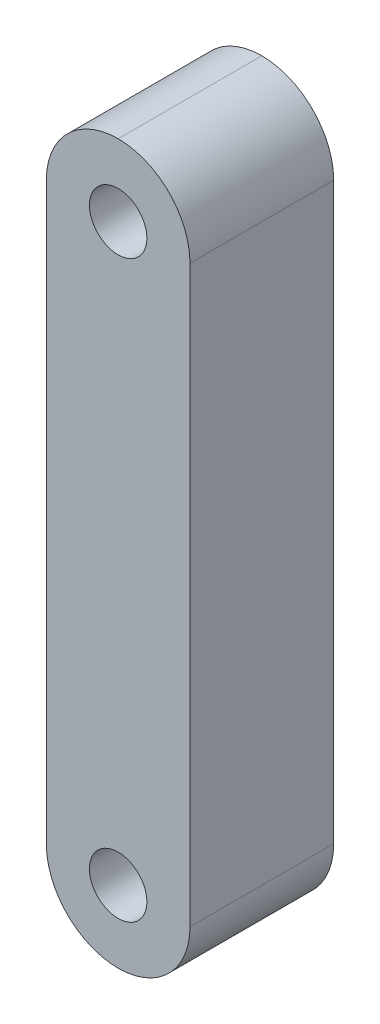
ISO-10303-21;
HEADER;
FILE_DESCRIPTION(('STEP AP214'),'2;1');
FILE_NAME('part.step','',(''),(''),'','','');
FILE_SCHEMA(('AUTOMOTIVE_DESIGN { 1 0 10303 214 1 1 1 1 }'));
ENDSEC;
DATA;
#1=APPLICATION_CONTEXT('core data for automotive mechanical design processes');
#2=APPLICATION_PROTOCOL_DEFINITION('international standard','automotive_design',2000,#1);
#3=PRODUCT_CONTEXT('',#1,'mechanical');
#4=PRODUCT('Part','Part','',(#3));
#5=PRODUCT_RELATED_PRODUCT_CATEGORY('part','',(#4));
#6=PRODUCT_DEFINITION_FORMATION('','',#4);
#7=PRODUCT_DEFINITION_CONTEXT('part definition',#1,'design');
#8=PRODUCT_DEFINITION('design','',#6,#7);
#9=PRODUCT_DEFINITION_SHAPE('','',#8);
#10=(LENGTH_UNIT() NAMED_UNIT(*) SI_UNIT(.MILLI.,.METRE.));
#11=(NAMED_UNIT(*) PLANE_ANGLE_UNIT() SI_UNIT($,.RADIAN.));
#12=(NAMED_UNIT(*) SI_UNIT($,.STERADIAN.) SOLID_ANGLE_UNIT());
#13=UNCERTAINTY_MEASURE_WITH_UNIT(LENGTH_MEASURE(1.E-05),#10,'distance_accuracy_value','');
#14=(GEOMETRIC_REPRESENTATION_CONTEXT(3) GLOBAL_UNCERTAINTY_ASSIGNED_CONTEXT((#13)) GLOBAL_UNIT_ASSIGNED_CONTEXT((#10,
#11,#12)) REPRESENTATION_CONTEXT('',''));
#15=CARTESIAN_POINT('',(0.,0.,0.));
#16=DIRECTION('',(0.,0.,1.));
#17=DIRECTION('',(1.,0.,0.));
#18=AXIS2_PLACEMENT_3D('',#15,#16,#17);
#19=CARTESIAN_POINT('',(0.,0.,10.));
#20=DIRECTION('',(1.,0.,0.));
#21=DIRECTION('',(0.,0.,-1.));
#22=AXIS2_PLACEMENT_3D('',#19,#20,#21);
#23=PLANE('',#22);
#24=DIRECTION('',(0.,-1.,0.));
#25=VECTOR('',#24,1.);
#26=CARTESIAN_POINT('',(0.,0.,0.));
#27=LINE('',#26,#25);
#28=CARTESIAN_POINT('',(0.,45.,0.));
#29=VERTEX_POINT('',#28);
#30=CARTESIAN_POINT('',(0.,5.,0.));
#31=VERTEX_POINT('',#30);
#32=EDGE_CURVE('E114',#29,#31,#27,.T.);
#33=ORIENTED_EDGE('',*,*,#32,.T.);
#34=DIRECTION('',(0.,0.,-1.));
#35=VECTOR('',#34,1.);
#36=CARTESIAN_POINT('',(0.,5.,10.));
#37=LINE('',#36,#35);
#38=CARTESIAN_POINT('',(0.,5.,10.));
#39=VERTEX_POINT('',#38);
#40=EDGE_CURVE('E11',#31,#39,#37,.F.);
#41=ORIENTED_EDGE('',*,*,#40,.T.);
#42=DIRECTION('',(0.,-1.,0.));
#43=VECTOR('',#42,1.);
#44=CARTESIAN_POINT('',(0.,0.,10.));
#45=LINE('',#44,#43);
#46=CARTESIAN_POINT('',(0.,45.,10.));
#47=VERTEX_POINT('',#46);
#48=EDGE_CURVE('E113',#47,#39,#45,.T.);
#49=ORIENTED_EDGE('',*,*,#48,.F.);
#50=DIRECTION('',(0.,0.,-1.));
#51=VECTOR('',#50,1.);
#52=CARTESIAN_POINT('',(0.,45.,10.));
#53=LINE('',#52,#51);
#54=EDGE_CURVE('E42',#47,#29,#53,.T.);
#55=ORIENTED_EDGE('',*,*,#54,.T.);
#56=EDGE_LOOP('',(#33,#41,#49,#55));
#57=FACE_BOUND('',#56,.T.);
#58=ADVANCED_FACE('F33',(#57),#23,.F.);
#59=CARTESIAN_POINT('',(10.,0.,10.));
#60=DIRECTION('',(-1.,0.,0.));
#61=DIRECTION('',(0.,0.,1.));
#62=AXIS2_PLACEMENT_3D('',#59,#60,#61);
#63=PLANE('',#62);
#64=DIRECTION('',(0.,1.,0.));
#65=VECTOR('',#64,1.);
#66=CARTESIAN_POINT('',(10.,0.,10.));
#67=LINE('',#66,#65);
#68=CARTESIAN_POINT('',(10.,5.,10.));
#69=VERTEX_POINT('',#68);
#70=CARTESIAN_POINT('',(10.,45.,10.));
#71=VERTEX_POINT('',#70);
#72=EDGE_CURVE('E106',#69,#71,#67,.T.);
#73=ORIENTED_EDGE('',*,*,#72,.F.);
#74=DIRECTION('',(0.,0.,-1.));
#75=VECTOR('',#74,1.);
#76=CARTESIAN_POINT('',(10.,5.,10.));
#77=LINE('',#76,#75);
#78=CARTESIAN_POINT('',(10.,5.,0.));
#79=VERTEX_POINT('',#78);
#80=EDGE_CURVE('E91',#69,#79,#77,.T.);
#81=ORIENTED_EDGE('',*,*,#80,.T.);
#82=DIRECTION('',(0.,1.,0.));
#83=VECTOR('',#82,1.);
#84=CARTESIAN_POINT('',(10.,0.,0.));
#85=LINE('',#84,#83);
#86=CARTESIAN_POINT('',(10.,45.,0.));
#87=VERTEX_POINT('',#86);
#88=EDGE_CURVE('E104',#79,#87,#85,.T.);
#89=ORIENTED_EDGE('',*,*,#88,.T.);
#90=DIRECTION('',(0.,0.,-1.));
#91=VECTOR('',#90,1.);
#92=CARTESIAN_POINT('',(10.,45.,10.));
#93=LINE('',#92,#91);
#94=EDGE_CURVE('E108',#87,#71,#93,.F.);
#95=ORIENTED_EDGE('',*,*,#94,.T.);
#96=EDGE_LOOP('',(#73,#81,#89,#95));
#97=FACE_BOUND('',#96,.T.);
#98=ADVANCED_FACE('F102',(#97),#63,.F.);
#99=CARTESIAN_POINT('',(0.,0.,10.));
#100=DIRECTION('',(0.,0.,-1.));
#101=DIRECTION('',(-1.,0.,0.));
#102=AXIS2_PLACEMENT_3D('',#99,#100,#101);
#103=PLANE('',#102);
#104=CARTESIAN_POINT('',(5.,5.,10.));
#105=DIRECTION('',(0.,0.,1.));
#106=DIRECTION('',(1.,0.,0.));
#107=AXIS2_PLACEMENT_3D('',#104,#105,#106);
#108=CIRCLE('',#107,2.);
#109=CARTESIAN_POINT('',(7.,5.,10.));
#110=VERTEX_POINT('',#109);
#111=EDGE_CURVE('E131',#110,#110,#108,.T.);
#112=ORIENTED_EDGE('',*,*,#111,.F.);
#113=EDGE_LOOP('',(#112));
#114=FACE_BOUND('',#113,.T.);
#115=CARTESIAN_POINT('',(5.,45.,10.));
#116=DIRECTION('',(0.,0.,1.));
#117=DIRECTION('',(1.,0.,0.));
#118=AXIS2_PLACEMENT_3D('',#115,#116,#117);
#119=CIRCLE('',#118,2.);
#120=CARTESIAN_POINT('',(7.,45.,10.));
#121=VERTEX_POINT('',#120);
#122=EDGE_CURVE('E150',#121,#121,#119,.T.);
#123=ORIENTED_EDGE('',*,*,#122,.F.);
#124=EDGE_LOOP('',(#123));
#125=FACE_BOUND('',#124,.T.);
#126=CARTESIAN_POINT('',(5.,5.,10.));
#127=DIRECTION('',(0.,0.,-1.));
#128=DIRECTION('',(-1.,0.,0.));
#129=AXIS2_PLACEMENT_3D('',#126,#127,#128);
#130=CIRCLE('',#129,5.);
#131=CARTESIAN_POINT('',(5.,0.,10.));
#132=VERTEX_POINT('',#131);
#133=EDGE_CURVE('E57',#39,#132,#130,.F.);
#134=ORIENTED_EDGE('',*,*,#133,.T.);
#135=CARTESIAN_POINT('',(5.,5.,10.));
#136=DIRECTION('',(0.,0.,-1.));
#137=DIRECTION('',(-1.,0.,0.));
#138=AXIS2_PLACEMENT_3D('',#135,#136,#137);
#139=CIRCLE('',#138,5.);
#140=EDGE_CURVE('E129',#132,#69,#139,.F.);
#141=ORIENTED_EDGE('',*,*,#140,.T.);
#142=ORIENTED_EDGE('',*,*,#72,.T.);
#143=CARTESIAN_POINT('',(5.,45.,10.));
#144=DIRECTION('',(0.,0.,-1.));
#145=DIRECTION('',(-1.,0.,0.));
#146=AXIS2_PLACEMENT_3D('',#143,#144,#145);
#147=CIRCLE('',#146,5.);
#148=CARTESIAN_POINT('',(5.,50.,10.));
#149=VERTEX_POINT('',#148);
#150=EDGE_CURVE('E50',#71,#149,#147,.F.);
#151=ORIENTED_EDGE('',*,*,#150,.T.);
#152=CARTESIAN_POINT('',(5.,45.,10.));
#153=DIRECTION('',(0.,0.,-1.));
#154=DIRECTION('',(-1.,0.,0.));
#155=AXIS2_PLACEMENT_3D('',#152,#153,#154);
#156=CIRCLE('',#155,5.);
#157=EDGE_CURVE('E96',#149,#47,#156,.F.);
#158=ORIENTED_EDGE('',*,*,#157,.T.);
#159=ORIENTED_EDGE('',*,*,#48,.T.);
#160=EDGE_LOOP('',(#134,#141,#142,#151,#158,#159));
#161=FACE_BOUND('',#160,.T.);
#162=ADVANCED_FACE('F143',(#114,#125,#161),#103,.F.);
#163=CARTESIAN_POINT('',(0.,0.,0.));
#164=DIRECTION('',(0.,0.,-1.));
#165=DIRECTION('',(-1.,0.,0.));
#166=AXIS2_PLACEMENT_3D('',#163,#164,#165);
#167=PLANE('',#166);
#168=CARTESIAN_POINT('',(5.,5.,0.));
#169=DIRECTION('',(0.,0.,1.));
#170=DIRECTION('',(1.,0.,0.));
#171=AXIS2_PLACEMENT_3D('',#168,#169,#170);
#172=CIRCLE('',#171,2.);
#173=CARTESIAN_POINT('',(7.,5.,0.));
#174=VERTEX_POINT('',#173);
#175=EDGE_CURVE('E133',#174,#174,#172,.T.);
#176=ORIENTED_EDGE('',*,*,#175,.T.);
#177=EDGE_LOOP('',(#176));
#178=FACE_BOUND('',#177,.T.);
#179=CARTESIAN_POINT('',(5.,45.,0.));
#180=DIRECTION('',(0.,0.,1.));
#181=DIRECTION('',(1.,0.,0.));
#182=AXIS2_PLACEMENT_3D('',#179,#180,#181);
#183=CIRCLE('',#182,2.);
#184=CARTESIAN_POINT('',(7.,45.,0.));
#185=VERTEX_POINT('',#184);
#186=EDGE_CURVE('E118',#185,#185,#183,.T.);
#187=ORIENTED_EDGE('',*,*,#186,.T.);
#188=EDGE_LOOP('',(#187));
#189=FACE_BOUND('',#188,.T.);
#190=ORIENTED_EDGE('',*,*,#88,.F.);
#191=CARTESIAN_POINT('',(5.,5.,0.));
#192=DIRECTION('',(0.,0.,-1.));
#193=DIRECTION('',(-1.,0.,0.));
#194=AXIS2_PLACEMENT_3D('',#191,#192,#193);
#195=CIRCLE('',#194,5.);
#196=CARTESIAN_POINT('',(5.,0.,0.));
#197=VERTEX_POINT('',#196);
#198=EDGE_CURVE('E87',#79,#197,#195,.T.);
#199=ORIENTED_EDGE('',*,*,#198,.T.);
#200=CARTESIAN_POINT('',(5.,5.,0.));
#201=DIRECTION('',(0.,0.,-1.));
#202=DIRECTION('',(-1.,0.,0.));
#203=AXIS2_PLACEMENT_3D('',#200,#201,#202);
#204=CIRCLE('',#203,5.);
#205=EDGE_CURVE('E97',#197,#31,#204,.T.);
#206=ORIENTED_EDGE('',*,*,#205,.T.);
#207=ORIENTED_EDGE('',*,*,#32,.F.);
#208=CARTESIAN_POINT('',(5.,45.,0.));
#209=DIRECTION('',(0.,0.,-1.));
#210=DIRECTION('',(-1.,0.,0.));
#211=AXIS2_PLACEMENT_3D('',#208,#209,#210);
#212=CIRCLE('',#211,5.);
#213=CARTESIAN_POINT('',(5.,50.,0.));
#214=VERTEX_POINT('',#213);
#215=EDGE_CURVE('E107',#29,#214,#212,.T.);
#216=ORIENTED_EDGE('',*,*,#215,.T.);
#217=CARTESIAN_POINT('',(5.,45.,0.));
#218=DIRECTION('',(0.,0.,-1.));
#219=DIRECTION('',(-1.,0.,0.));
#220=AXIS2_PLACEMENT_3D('',#217,#218,#219);
#221=CIRCLE('',#220,5.);
#222=EDGE_CURVE('E112',#214,#87,#221,.T.);
#223=ORIENTED_EDGE('',*,*,#222,.T.);
#224=EDGE_LOOP('',(#190,#199,#206,#207,#216,#223));
#225=FACE_BOUND('',#224,.T.);
#226=ADVANCED_FACE('F110',(#178,#189,#225),#167,.T.);
#227=CARTESIAN_POINT('',(5.,45.,0.));
#228=DIRECTION('',(0.,0.,1.));
#229=DIRECTION('',(1.,0.,0.));
#230=AXIS2_PLACEMENT_3D('',#227,#228,#229);
#231=CYLINDRICAL_SURFACE('',#230,2.);
#232=ORIENTED_EDGE('',*,*,#186,.F.);
#233=EDGE_LOOP('',(#232));
#234=FACE_BOUND('',#233,.T.);
#235=ORIENTED_EDGE('',*,*,#122,.T.);
#236=EDGE_LOOP('',(#235));
#237=FACE_BOUND('',#236,.T.);
#238=ADVANCED_FACE('F163',(#234,#237),#231,.F.);
#239=CARTESIAN_POINT('',(5.,5.,0.));
#240=DIRECTION('',(0.,0.,1.));
#241=DIRECTION('',(1.,0.,0.));
#242=AXIS2_PLACEMENT_3D('',#239,#240,#241);
#243=CYLINDRICAL_SURFACE('',#242,2.);
#244=ORIENTED_EDGE('',*,*,#175,.F.);
#245=EDGE_LOOP('',(#244));
#246=FACE_BOUND('',#245,.T.);
#247=ORIENTED_EDGE('',*,*,#111,.T.);
#248=EDGE_LOOP('',(#247));
#249=FACE_BOUND('',#248,.T.);
#250=ADVANCED_FACE('F160',(#246,#249),#243,.F.);
#251=CARTESIAN_POINT('',(5.,5.,10.));
#252=DIRECTION('',(0.,0.,-1.));
#253=DIRECTION('',(-1.,0.,0.));
#254=AXIS2_PLACEMENT_3D('',#251,#252,#253);
#255=CYLINDRICAL_SURFACE('',#254,5.);
#256=DIRECTION('',(0.,0.,-1.));
#257=VECTOR('',#256,1.);
#258=CARTESIAN_POINT('',(5.,0.,10.));
#259=LINE('',#258,#257);
#260=EDGE_CURVE('E92',#132,#197,#259,.T.);
#261=ORIENTED_EDGE('',*,*,#260,.F.);
#262=ORIENTED_EDGE('',*,*,#133,.F.);
#263=ORIENTED_EDGE('',*,*,#40,.F.);
#264=ORIENTED_EDGE('',*,*,#205,.F.);
#265=EDGE_LOOP('',(#261,#262,#263,#264));
#266=FACE_BOUND('',#265,.T.);
#267=ADVANCED_FACE('F148',(#266),#255,.T.);
#268=CARTESIAN_POINT('',(5.,5.,10.));
#269=DIRECTION('',(0.,0.,-1.));
#270=DIRECTION('',(-1.,0.,0.));
#271=AXIS2_PLACEMENT_3D('',#268,#269,#270);
#272=CYLINDRICAL_SURFACE('',#271,5.);
#273=ORIENTED_EDGE('',*,*,#140,.F.);
#274=ORIENTED_EDGE('',*,*,#260,.T.);
#275=ORIENTED_EDGE('',*,*,#198,.F.);
#276=ORIENTED_EDGE('',*,*,#80,.F.);
#277=EDGE_LOOP('',(#273,#274,#275,#276));
#278=FACE_BOUND('',#277,.T.);
#279=ADVANCED_FACE('F90',(#278),#272,.T.);
#280=CARTESIAN_POINT('',(5.,45.,10.));
#281=DIRECTION('',(0.,0.,-1.));
#282=DIRECTION('',(-1.,0.,0.));
#283=AXIS2_PLACEMENT_3D('',#280,#281,#282);
#284=CYLINDRICAL_SURFACE('',#283,5.);
#285=ORIENTED_EDGE('',*,*,#54,.F.);
#286=ORIENTED_EDGE('',*,*,#157,.F.);
#287=DIRECTION('',(0.,0.,-1.));
#288=VECTOR('',#287,1.);
#289=CARTESIAN_POINT('',(5.,50.,10.));
#290=LINE('',#289,#288);
#291=EDGE_CURVE('E37',#214,#149,#290,.F.);
#292=ORIENTED_EDGE('',*,*,#291,.F.);
#293=ORIENTED_EDGE('',*,*,#215,.F.);
#294=EDGE_LOOP('',(#285,#286,#292,#293));
#295=FACE_BOUND('',#294,.T.);
#296=ADVANCED_FACE('F35',(#295),#284,.T.);
#297=CARTESIAN_POINT('',(5.,45.,10.));
#298=DIRECTION('',(0.,0.,-1.));
#299=DIRECTION('',(-1.,0.,0.));
#300=AXIS2_PLACEMENT_3D('',#297,#298,#299);
#301=CYLINDRICAL_SURFACE('',#300,5.);
#302=ORIENTED_EDGE('',*,*,#150,.F.);
#303=ORIENTED_EDGE('',*,*,#94,.F.);
#304=ORIENTED_EDGE('',*,*,#222,.F.);
#305=ORIENTED_EDGE('',*,*,#291,.T.);
#306=EDGE_LOOP('',(#302,#303,#304,#305));
#307=FACE_BOUND('',#306,.T.);
#308=ADVANCED_FACE('F138',(#307),#301,.T.);
#309=CLOSED_SHELL('',(#58,#98,#162,#226,#238,#250,#267,#279,#296,#308));
#310=MANIFOLD_SOLID_BREP('B2',#309);
#311=ADVANCED_BREP_SHAPE_REPRESENTATION('',(#18,#310),#14);
#312=SHAPE_DEFINITION_REPRESENTATION(#9,#311);
ENDSEC;
END-ISO-10303-21;
